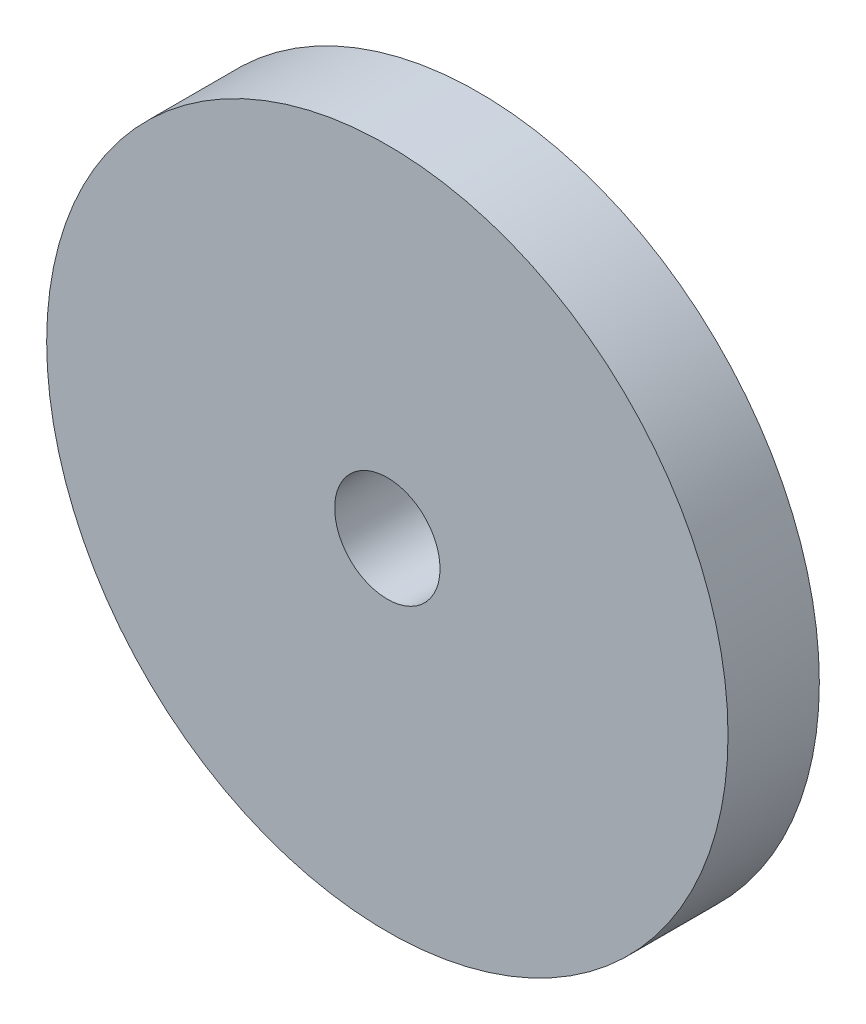
ISO-10303-21;
HEADER;
FILE_DESCRIPTION(('STEP AP214'),'2;1');
FILE_NAME('part.step','',(''),(''),'','','');
FILE_SCHEMA(('AUTOMOTIVE_DESIGN { 1 0 10303 214 1 1 1 1 }'));
ENDSEC;
DATA;
#1=APPLICATION_CONTEXT('core data for automotive mechanical design processes');
#2=APPLICATION_PROTOCOL_DEFINITION('international standard','automotive_design',2000,#1);
#3=PRODUCT_CONTEXT('',#1,'mechanical');
#4=PRODUCT('Part','Part','',(#3));
#5=PRODUCT_RELATED_PRODUCT_CATEGORY('part','',(#4));
#6=PRODUCT_DEFINITION_FORMATION('','',#4);
#7=PRODUCT_DEFINITION_CONTEXT('part definition',#1,'design');
#8=PRODUCT_DEFINITION('design','',#6,#7);
#9=PRODUCT_DEFINITION_SHAPE('','',#8);
#10=(LENGTH_UNIT() NAMED_UNIT(*) SI_UNIT(.MILLI.,.METRE.));
#11=(NAMED_UNIT(*) PLANE_ANGLE_UNIT() SI_UNIT($,.RADIAN.));
#12=(NAMED_UNIT(*) SI_UNIT($,.STERADIAN.) SOLID_ANGLE_UNIT());
#13=UNCERTAINTY_MEASURE_WITH_UNIT(LENGTH_MEASURE(1.E-05),#10,'distance_accuracy_value','');
#14=(GEOMETRIC_REPRESENTATION_CONTEXT(3) GLOBAL_UNCERTAINTY_ASSIGNED_CONTEXT((#13)) GLOBAL_UNIT_ASSIGNED_CONTEXT((#10,
#11,#12)) REPRESENTATION_CONTEXT('',''));
#15=CARTESIAN_POINT('',(0.,0.,0.));
#16=DIRECTION('',(0.,0.,1.));
#17=DIRECTION('',(1.,0.,0.));
#18=AXIS2_PLACEMENT_3D('',#15,#16,#17);
#19=CARTESIAN_POINT('',(24.25,0.,0.));
#20=DIRECTION('',(0.,0.,-1.));
#21=DIRECTION('',(-1.,0.,0.));
#22=AXIS2_PLACEMENT_3D('',#19,#20,#21);
#23=PLANE('',#22);
#24=CARTESIAN_POINT('',(0.,0.,0.));
#25=DIRECTION('',(0.,0.,1.));
#26=DIRECTION('',(1.,0.,0.));
#27=AXIS2_PLACEMENT_3D('',#24,#25,#26);
#28=CIRCLE('',#27,5.);
#29=CARTESIAN_POINT('',(5.,0.,0.));
#30=VERTEX_POINT('',#29);
#31=EDGE_CURVE('E55',#30,#30,#28,.T.);
#32=ORIENTED_EDGE('',*,*,#31,.T.);
#33=EDGE_LOOP('',(#32));
#34=FACE_BOUND('',#33,.T.);
#35=CARTESIAN_POINT('',(0.,0.,0.));
#36=DIRECTION('',(0.,0.,1.));
#37=DIRECTION('',(1.,0.,0.));
#38=AXIS2_PLACEMENT_3D('',#35,#36,#37);
#39=CIRCLE('',#38,24.25);
#40=CARTESIAN_POINT('',(24.25,0.,0.));
#41=VERTEX_POINT('',#40);
#42=EDGE_CURVE('E10',#41,#41,#39,.T.);
#43=ORIENTED_EDGE('',*,*,#42,.F.);
#44=EDGE_LOOP('',(#43));
#45=FACE_BOUND('',#44,.T.);
#46=ADVANCED_FACE('F33',(#34,#45),#23,.T.);
#47=CARTESIAN_POINT('',(0.,0.,-1.));
#48=DIRECTION('',(0.,0.,1.));
#49=DIRECTION('',(1.,0.,0.));
#50=AXIS2_PLACEMENT_3D('',#47,#48,#49);
#51=CYLINDRICAL_SURFACE('',#50,24.25);
#52=ORIENTED_EDGE('',*,*,#42,.T.);
#53=EDGE_LOOP('',(#52));
#54=FACE_BOUND('',#53,.T.);
#55=CARTESIAN_POINT('',(0.,0.,6.5));
#56=DIRECTION('',(0.,0.,1.));
#57=DIRECTION('',(1.,0.,0.));
#58=AXIS2_PLACEMENT_3D('',#55,#56,#57);
#59=CIRCLE('',#58,24.25);
#60=CARTESIAN_POINT('',(24.25,0.,6.5));
#61=VERTEX_POINT('',#60);
#62=EDGE_CURVE('E39',#61,#61,#59,.T.);
#63=ORIENTED_EDGE('',*,*,#62,.F.);
#64=EDGE_LOOP('',(#63));
#65=FACE_BOUND('',#64,.T.);
#66=ADVANCED_FACE('F73',(#54,#65),#51,.T.);
#67=CARTESIAN_POINT('',(3.75,0.,6.5));
#68=DIRECTION('',(0.,0.,1.));
#69=DIRECTION('',(1.,0.,0.));
#70=AXIS2_PLACEMENT_3D('',#67,#68,#69);
#71=PLANE('',#70);
#72=ORIENTED_EDGE('',*,*,#62,.T.);
#73=EDGE_LOOP('',(#72));
#74=FACE_BOUND('',#73,.T.);
#75=CARTESIAN_POINT('',(0.,0.,6.5));
#76=DIRECTION('',(0.,0.,1.));
#77=DIRECTION('',(1.,0.,0.));
#78=AXIS2_PLACEMENT_3D('',#75,#76,#77);
#79=CIRCLE('',#78,3.75);
#80=CARTESIAN_POINT('',(3.75,0.,6.5));
#81=VERTEX_POINT('',#80);
#82=EDGE_CURVE('E43',#81,#81,#79,.T.);
#83=ORIENTED_EDGE('',*,*,#82,.F.);
#84=EDGE_LOOP('',(#83));
#85=FACE_BOUND('',#84,.T.);
#86=ADVANCED_FACE('F77',(#74,#85),#71,.T.);
#87=CARTESIAN_POINT('',(0.,0.,-1.));
#88=DIRECTION('',(0.,0.,1.));
#89=DIRECTION('',(1.,0.,0.));
#90=AXIS2_PLACEMENT_3D('',#87,#88,#89);
#91=CYLINDRICAL_SURFACE('',#90,3.75);
#92=ORIENTED_EDGE('',*,*,#82,.T.);
#93=EDGE_LOOP('',(#92));
#94=FACE_BOUND('',#93,.T.);
#95=CARTESIAN_POINT('',(0.,0.,-1.));
#96=DIRECTION('',(0.,0.,1.));
#97=DIRECTION('',(1.,0.,0.));
#98=AXIS2_PLACEMENT_3D('',#95,#96,#97);
#99=CIRCLE('',#98,3.75);
#100=CARTESIAN_POINT('',(3.75,0.,-1.));
#101=VERTEX_POINT('',#100);
#102=EDGE_CURVE('E47',#101,#101,#99,.T.);
#103=ORIENTED_EDGE('',*,*,#102,.F.);
#104=EDGE_LOOP('',(#103));
#105=FACE_BOUND('',#104,.T.);
#106=ADVANCED_FACE('F69',(#94,#105),#91,.F.);
#107=CARTESIAN_POINT('',(5.,0.,-1.));
#108=DIRECTION('',(0.,0.,-1.));
#109=DIRECTION('',(-1.,0.,0.));
#110=AXIS2_PLACEMENT_3D('',#107,#108,#109);
#111=PLANE('',#110);
#112=ORIENTED_EDGE('',*,*,#102,.T.);
#113=EDGE_LOOP('',(#112));
#114=FACE_BOUND('',#113,.T.);
#115=CARTESIAN_POINT('',(0.,0.,-1.));
#116=DIRECTION('',(0.,0.,1.));
#117=DIRECTION('',(1.,0.,0.));
#118=AXIS2_PLACEMENT_3D('',#115,#116,#117);
#119=CIRCLE('',#118,5.);
#120=CARTESIAN_POINT('',(5.,0.,-1.));
#121=VERTEX_POINT('',#120);
#122=EDGE_CURVE('E52',#121,#121,#119,.T.);
#123=ORIENTED_EDGE('',*,*,#122,.F.);
#124=EDGE_LOOP('',(#123));
#125=FACE_BOUND('',#124,.T.);
#126=ADVANCED_FACE('F63',(#114,#125),#111,.T.);
#127=CARTESIAN_POINT('',(0.,0.,-1.));
#128=DIRECTION('',(0.,0.,1.));
#129=DIRECTION('',(1.,0.,0.));
#130=AXIS2_PLACEMENT_3D('',#127,#128,#129);
#131=CYLINDRICAL_SURFACE('',#130,5.);
#132=ORIENTED_EDGE('',*,*,#122,.T.);
#133=EDGE_LOOP('',(#132));
#134=FACE_BOUND('',#133,.T.);
#135=ORIENTED_EDGE('',*,*,#31,.F.);
#136=EDGE_LOOP('',(#135));
#137=FACE_BOUND('',#136,.T.);
#138=ADVANCED_FACE('F61',(#134,#137),#131,.T.);
#139=CLOSED_SHELL('',(#46,#66,#86,#106,#126,#138));
#140=MANIFOLD_SOLID_BREP('B2',#139);
#141=ADVANCED_BREP_SHAPE_REPRESENTATION('',(#18,#140),#14);
#142=SHAPE_DEFINITION_REPRESENTATION(#9,#141);
ENDSEC;
END-ISO-10303-21;
